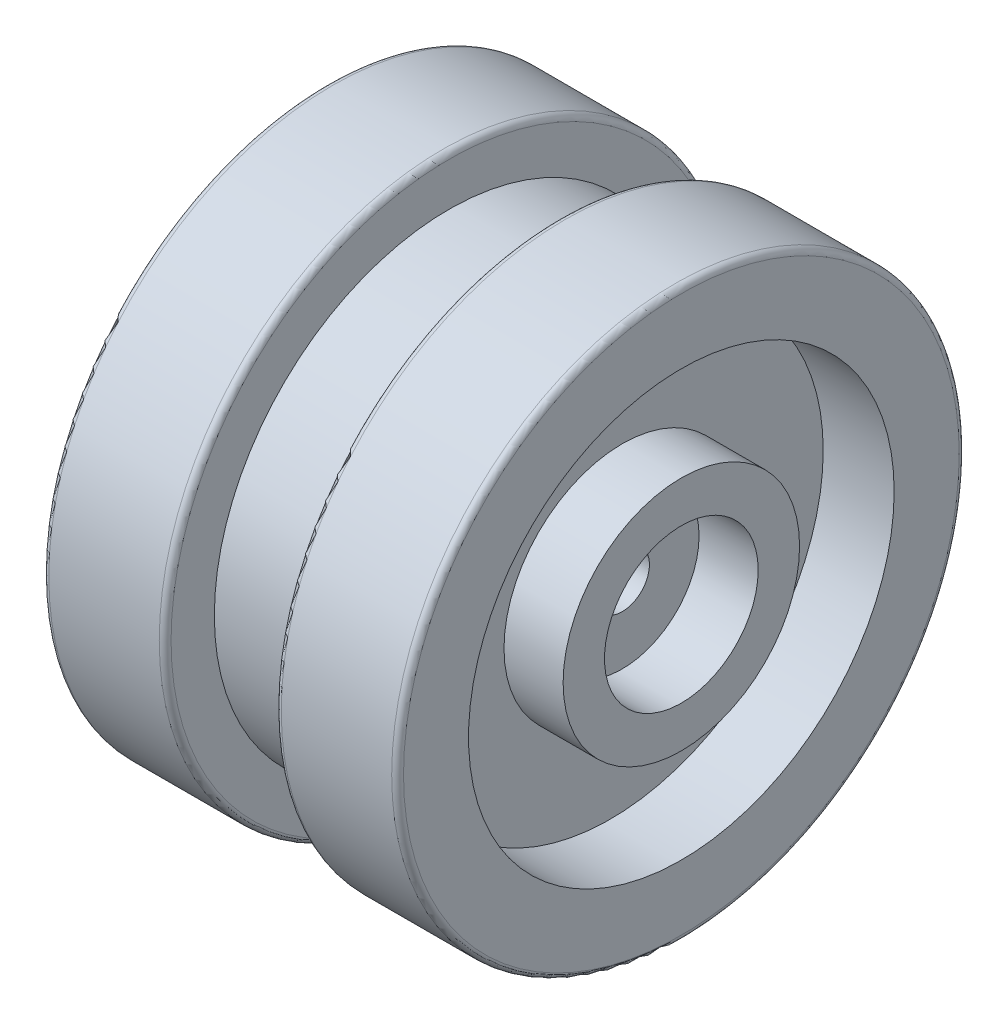
ISO-10303-21;
HEADER;
FILE_DESCRIPTION(('STEP AP214'),'2;1');
FILE_NAME('part.step','',(''),(''),'','','');
FILE_SCHEMA(('AUTOMOTIVE_DESIGN { 1 0 10303 214 1 1 1 1 }'));
ENDSEC;
DATA;
#1=APPLICATION_CONTEXT('core data for automotive mechanical design processes');
#2=APPLICATION_PROTOCOL_DEFINITION('international standard','automotive_design',2000,#1);
#3=PRODUCT_CONTEXT('',#1,'mechanical');
#4=PRODUCT('Part','Part','',(#3));
#5=PRODUCT_RELATED_PRODUCT_CATEGORY('part','',(#4));
#6=PRODUCT_DEFINITION_FORMATION('','',#4);
#7=PRODUCT_DEFINITION_CONTEXT('part definition',#1,'design');
#8=PRODUCT_DEFINITION('design','',#6,#7);
#9=PRODUCT_DEFINITION_SHAPE('','',#8);
#10=(LENGTH_UNIT() NAMED_UNIT(*) SI_UNIT(.MILLI.,.METRE.));
#11=(NAMED_UNIT(*) PLANE_ANGLE_UNIT() SI_UNIT($,.RADIAN.));
#12=(NAMED_UNIT(*) SI_UNIT($,.STERADIAN.) SOLID_ANGLE_UNIT());
#13=UNCERTAINTY_MEASURE_WITH_UNIT(LENGTH_MEASURE(1.E-05),#10,'distance_accuracy_value','');
#14=(GEOMETRIC_REPRESENTATION_CONTEXT(3) GLOBAL_UNCERTAINTY_ASSIGNED_CONTEXT((#13)) GLOBAL_UNIT_ASSIGNED_CONTEXT((#10,
#11,#12)) REPRESENTATION_CONTEXT('',''));
#15=CARTESIAN_POINT('',(0.,0.,0.));
#16=DIRECTION('',(0.,0.,1.));
#17=DIRECTION('',(1.,0.,0.));
#18=AXIS2_PLACEMENT_3D('',#15,#16,#17);
#19=CARTESIAN_POINT('',(7.57479912463906,-18.4842605379604,0.));
#20=DIRECTION('',(1.,0.,0.));
#21=DIRECTION('',(0.,0.,-1.));
#22=AXIS2_PLACEMENT_3D('',#19,#20,#21);
#23=CYLINDRICAL_SURFACE('',#22,8.);
#24=CARTESIAN_POINT('',(11.5747991246391,-18.4842605379604,0.));
#25=DIRECTION('',(1.,0.,0.));
#26=DIRECTION('',(0.,0.,-1.));
#27=AXIS2_PLACEMENT_3D('',#24,#25,#26);
#28=CIRCLE('',#27,8.);
#29=CARTESIAN_POINT('',(11.5747991246391,-18.4842605379604,-8.));
#30=VERTEX_POINT('',#29);
#31=EDGE_CURVE('E10',#30,#30,#28,.T.);
#32=ORIENTED_EDGE('',*,*,#31,.T.);
#33=EDGE_LOOP('',(#32));
#34=FACE_BOUND('',#33,.T.);
#35=CARTESIAN_POINT('',(12.5747991246391,-18.4842605379604,0.));
#36=DIRECTION('',(1.,0.,0.));
#37=DIRECTION('',(0.,0.,-1.));
#38=AXIS2_PLACEMENT_3D('',#35,#36,#37);
#39=CIRCLE('',#38,8.);
#40=CARTESIAN_POINT('',(12.5747991246391,-18.4842605379604,-8.));
#41=VERTEX_POINT('',#40);
#42=EDGE_CURVE('E63',#41,#41,#39,.F.);
#43=ORIENTED_EDGE('',*,*,#42,.T.);
#44=EDGE_LOOP('',(#43));
#45=FACE_BOUND('',#44,.T.);
#46=ADVANCED_FACE('F45',(#34,#45),#23,.T.);
#47=CARTESIAN_POINT('',(-2.08520087536094,1.35573946203964,0.));
#48=DIRECTION('',(-1.,0.,0.));
#49=DIRECTION('',(0.,0.,1.));
#50=AXIS2_PLACEMENT_3D('',#47,#48,#49);
#51=PLANE('',#50);
#52=CARTESIAN_POINT('',(-2.08520087536094,-18.4842605379604,0.));
#53=DIRECTION('',(-1.,0.,0.));
#54=DIRECTION('',(0.,0.,1.));
#55=AXIS2_PLACEMENT_3D('',#52,#53,#54);
#56=CIRCLE('',#55,23.5);
#57=CARTESIAN_POINT('',(-2.08520087536094,-18.4842605379604,23.5));
#58=VERTEX_POINT('',#57);
#59=EDGE_CURVE('E60',#58,#58,#56,.F.);
#60=ORIENTED_EDGE('',*,*,#59,.T.);
#61=EDGE_LOOP('',(#60));
#62=FACE_BOUND('',#61,.T.);
#63=CARTESIAN_POINT('',(-2.08520087536094,-18.4842605379604,0.));
#64=DIRECTION('',(-1.,0.,0.));
#65=DIRECTION('',(0.,0.,1.));
#66=AXIS2_PLACEMENT_3D('',#63,#64,#65);
#67=CIRCLE('',#66,19.84);
#68=CARTESIAN_POINT('',(-2.08520087536094,-18.4842605379604,19.84));
#69=VERTEX_POINT('',#68);
#70=EDGE_CURVE('E112',#69,#69,#67,.T.);
#71=ORIENTED_EDGE('',*,*,#70,.T.);
#72=EDGE_LOOP('',(#71));
#73=FACE_BOUND('',#72,.T.);
#74=ADVANCED_FACE('F150',(#62,#73),#51,.F.);
#75=CARTESIAN_POINT('',(-12.4252008753609,-18.4842605379604,0.));
#76=DIRECTION('',(-1.,0.,0.));
#77=DIRECTION('',(0.,0.,1.));
#78=AXIS2_PLACEMENT_3D('',#75,#76,#77);
#79=CYLINDRICAL_SURFACE('',#78,24.);
#80=CARTESIAN_POINT('',(-11.9252008753609,-18.4842605379604,0.));
#81=DIRECTION('',(1.,0.,0.));
#82=DIRECTION('',(0.,0.,-1.));
#83=AXIS2_PLACEMENT_3D('',#80,#81,#82);
#84=CIRCLE('',#83,24.);
#85=CARTESIAN_POINT('',(-11.9252008753609,-18.4842605379604,-24.));
#86=VERTEX_POINT('',#85);
#87=EDGE_CURVE('E143',#86,#86,#84,.T.);
#88=ORIENTED_EDGE('',*,*,#87,.T.);
#89=EDGE_LOOP('',(#88));
#90=FACE_BOUND('',#89,.T.);
#91=CARTESIAN_POINT('',(-2.58520087536094,-18.4842605379604,0.));
#92=DIRECTION('',(-1.,0.,0.));
#93=DIRECTION('',(0.,0.,1.));
#94=AXIS2_PLACEMENT_3D('',#91,#92,#93);
#95=CIRCLE('',#94,24.);
#96=CARTESIAN_POINT('',(-2.58520087536094,-18.4842605379604,24.));
#97=VERTEX_POINT('',#96);
#98=EDGE_CURVE('E139',#97,#97,#95,.T.);
#99=ORIENTED_EDGE('',*,*,#98,.T.);
#100=EDGE_LOOP('',(#99));
#101=FACE_BOUND('',#100,.T.);
#102=ADVANCED_FACE('F159',(#90,#101),#79,.T.);
#103=CARTESIAN_POINT('',(-12.4252008753609,5.51573946203964,0.));
#104=DIRECTION('',(1.,0.,0.));
#105=DIRECTION('',(0.,0.,-1.));
#106=AXIS2_PLACEMENT_3D('',#103,#104,#105);
#107=PLANE('',#106);
#108=CARTESIAN_POINT('',(-12.4252008753609,-18.4842605379604,0.));
#109=DIRECTION('',(-1.,0.,0.));
#110=DIRECTION('',(0.,0.,1.));
#111=AXIS2_PLACEMENT_3D('',#108,#109,#110);
#112=CIRCLE('',#111,18.);
#113=CARTESIAN_POINT('',(-12.4252008753609,-18.4842605379604,18.));
#114=VERTEX_POINT('',#113);
#115=EDGE_CURVE('E96',#114,#114,#112,.T.);
#116=ORIENTED_EDGE('',*,*,#115,.F.);
#117=EDGE_LOOP('',(#116));
#118=FACE_BOUND('',#117,.T.);
#119=CARTESIAN_POINT('',(-12.4252008753609,-18.4842605379604,0.));
#120=DIRECTION('',(1.,0.,0.));
#121=DIRECTION('',(0.,0.,-1.));
#122=AXIS2_PLACEMENT_3D('',#119,#120,#121);
#123=CIRCLE('',#122,23.5);
#124=CARTESIAN_POINT('',(-12.4252008753609,-18.4842605379604,-23.5));
#125=VERTEX_POINT('',#124);
#126=EDGE_CURVE('E135',#125,#125,#123,.F.);
#127=ORIENTED_EDGE('',*,*,#126,.T.);
#128=EDGE_LOOP('',(#127));
#129=FACE_BOUND('',#128,.T.);
#130=ADVANCED_FACE('F161',(#118,#129),#107,.F.);
#131=CARTESIAN_POINT('',(17.5747991246391,-18.4842605379604,0.));
#132=DIRECTION('',(-1.,0.,0.));
#133=DIRECTION('',(0.,0.,1.));
#134=AXIS2_PLACEMENT_3D('',#131,#132,#133);
#135=PLANE('',#134);
#136=CARTESIAN_POINT('',(17.5747991246391,-18.4842605379604,0.));
#137=DIRECTION('',(1.,0.,0.));
#138=DIRECTION('',(0.,0.,-1.));
#139=AXIS2_PLACEMENT_3D('',#136,#137,#138);
#140=CIRCLE('',#139,18.);
#141=CARTESIAN_POINT('',(17.5747991246391,-18.4842605379604,-18.));
#142=VERTEX_POINT('',#141);
#143=EDGE_CURVE('E104',#142,#142,#140,.T.);
#144=ORIENTED_EDGE('',*,*,#143,.F.);
#145=EDGE_LOOP('',(#144));
#146=FACE_BOUND('',#145,.T.);
#147=CARTESIAN_POINT('',(17.5747991246391,-18.4842605379604,0.));
#148=DIRECTION('',(-1.,0.,0.));
#149=DIRECTION('',(0.,0.,1.));
#150=AXIS2_PLACEMENT_3D('',#147,#148,#149);
#151=CIRCLE('',#150,23.5);
#152=CARTESIAN_POINT('',(17.5747991246391,-18.4842605379604,23.5));
#153=VERTEX_POINT('',#152);
#154=EDGE_CURVE('E131',#153,#153,#151,.F.);
#155=ORIENTED_EDGE('',*,*,#154,.T.);
#156=EDGE_LOOP('',(#155));
#157=FACE_BOUND('',#156,.T.);
#158=ADVANCED_FACE('F169',(#146,#157),#135,.F.);
#159=CARTESIAN_POINT('',(-12.4252008753609,-18.4842605379604,0.));
#160=DIRECTION('',(-1.,0.,0.));
#161=DIRECTION('',(0.,0.,1.));
#162=AXIS2_PLACEMENT_3D('',#159,#160,#161);
#163=CYLINDRICAL_SURFACE('',#162,24.);
#164=CARTESIAN_POINT('',(17.0747991246391,-18.4842605379604,0.));
#165=DIRECTION('',(-1.,0.,0.));
#166=DIRECTION('',(0.,0.,1.));
#167=AXIS2_PLACEMENT_3D('',#164,#165,#166);
#168=CIRCLE('',#167,24.);
#169=CARTESIAN_POINT('',(17.0747991246391,-18.4842605379604,24.));
#170=VERTEX_POINT('',#169);
#171=EDGE_CURVE('E127',#170,#170,#168,.T.);
#172=ORIENTED_EDGE('',*,*,#171,.T.);
#173=EDGE_LOOP('',(#172));
#174=FACE_BOUND('',#173,.T.);
#175=CARTESIAN_POINT('',(7.73479912463906,-18.4842605379604,0.));
#176=DIRECTION('',(1.,0.,0.));
#177=DIRECTION('',(0.,0.,-1.));
#178=AXIS2_PLACEMENT_3D('',#175,#176,#177);
#179=CIRCLE('',#178,24.);
#180=CARTESIAN_POINT('',(7.73479912463906,-18.4842605379604,-24.));
#181=VERTEX_POINT('',#180);
#182=EDGE_CURVE('E123',#181,#181,#179,.T.);
#183=ORIENTED_EDGE('',*,*,#182,.T.);
#184=EDGE_LOOP('',(#183));
#185=FACE_BOUND('',#184,.T.);
#186=ADVANCED_FACE('F215',(#174,#185),#163,.T.);
#187=CARTESIAN_POINT('',(7.23479912463906,1.35573946203964,0.));
#188=DIRECTION('',(1.,0.,0.));
#189=DIRECTION('',(0.,0.,-1.));
#190=AXIS2_PLACEMENT_3D('',#187,#188,#189);
#191=PLANE('',#190);
#192=CARTESIAN_POINT('',(7.23479912463906,-18.4842605379604,0.));
#193=DIRECTION('',(1.,0.,0.));
#194=DIRECTION('',(0.,0.,-1.));
#195=AXIS2_PLACEMENT_3D('',#192,#193,#194);
#196=CIRCLE('',#195,23.5);
#197=CARTESIAN_POINT('',(7.23479912463906,-18.4842605379604,-23.5));
#198=VERTEX_POINT('',#197);
#199=EDGE_CURVE('E54',#198,#198,#196,.F.);
#200=ORIENTED_EDGE('',*,*,#199,.T.);
#201=EDGE_LOOP('',(#200));
#202=FACE_BOUND('',#201,.T.);
#203=CARTESIAN_POINT('',(7.23479912463906,-18.4842605379604,0.));
#204=DIRECTION('',(-1.,0.,0.));
#205=DIRECTION('',(0.,0.,1.));
#206=AXIS2_PLACEMENT_3D('',#203,#204,#205);
#207=CIRCLE('',#206,19.84);
#208=CARTESIAN_POINT('',(7.23479912463906,-18.4842605379604,19.84));
#209=VERTEX_POINT('',#208);
#210=EDGE_CURVE('E119',#209,#209,#207,.T.);
#211=ORIENTED_EDGE('',*,*,#210,.F.);
#212=EDGE_LOOP('',(#211));
#213=FACE_BOUND('',#212,.T.);
#214=ADVANCED_FACE('F211',(#202,#213),#191,.F.);
#215=CARTESIAN_POINT('',(-12.4252008753609,-18.4842605379604,0.));
#216=DIRECTION('',(-1.,0.,0.));
#217=DIRECTION('',(0.,0.,1.));
#218=AXIS2_PLACEMENT_3D('',#215,#216,#217);
#219=CYLINDRICAL_SURFACE('',#218,19.84);
#220=ORIENTED_EDGE('',*,*,#70,.F.);
#221=EDGE_LOOP('',(#220));
#222=FACE_BOUND('',#221,.T.);
#223=ORIENTED_EDGE('',*,*,#210,.T.);
#224=EDGE_LOOP('',(#223));
#225=FACE_BOUND('',#224,.T.);
#226=ADVANCED_FACE('F207',(#222,#225),#219,.T.);
#227=CARTESIAN_POINT('',(17.0747991246391,-18.4842605379604,0.));
#228=DIRECTION('',(-1.,0.,0.));
#229=DIRECTION('',(0.,0.,1.));
#230=AXIS2_PLACEMENT_3D('',#227,#228,#229);
#231=TOROIDAL_SURFACE('',#230,23.5,0.5);
#232=ORIENTED_EDGE('',*,*,#154,.F.);
#233=EDGE_LOOP('',(#232));
#234=FACE_BOUND('',#233,.T.);
#235=ORIENTED_EDGE('',*,*,#171,.F.);
#236=EDGE_LOOP('',(#235));
#237=FACE_BOUND('',#236,.T.);
#238=ADVANCED_FACE('F210',(#234,#237),#231,.T.);
#239=CARTESIAN_POINT('',(-11.9252008753609,-18.4842605379604,0.));
#240=DIRECTION('',(1.,0.,0.));
#241=DIRECTION('',(0.,0.,-1.));
#242=AXIS2_PLACEMENT_3D('',#239,#240,#241);
#243=TOROIDAL_SURFACE('',#242,23.5,0.5);
#244=ORIENTED_EDGE('',*,*,#87,.F.);
#245=EDGE_LOOP('',(#244));
#246=FACE_BOUND('',#245,.T.);
#247=ORIENTED_EDGE('',*,*,#126,.F.);
#248=EDGE_LOOP('',(#247));
#249=FACE_BOUND('',#248,.T.);
#250=ADVANCED_FACE('F156',(#246,#249),#243,.T.);
#251=CARTESIAN_POINT('',(-2.58520087536094,-18.4842605379604,0.));
#252=DIRECTION('',(-1.,0.,0.));
#253=DIRECTION('',(0.,0.,1.));
#254=AXIS2_PLACEMENT_3D('',#251,#252,#253);
#255=TOROIDAL_SURFACE('',#254,23.5,0.5);
#256=ORIENTED_EDGE('',*,*,#59,.F.);
#257=EDGE_LOOP('',(#256));
#258=FACE_BOUND('',#257,.T.);
#259=ORIENTED_EDGE('',*,*,#98,.F.);
#260=EDGE_LOOP('',(#259));
#261=FACE_BOUND('',#260,.T.);
#262=ADVANCED_FACE('F153',(#258,#261),#255,.T.);
#263=CARTESIAN_POINT('',(7.73479912463906,-18.4842605379604,0.));
#264=DIRECTION('',(1.,0.,0.));
#265=DIRECTION('',(0.,0.,-1.));
#266=AXIS2_PLACEMENT_3D('',#263,#264,#265);
#267=TOROIDAL_SURFACE('',#266,23.5,0.5);
#268=ORIENTED_EDGE('',*,*,#182,.F.);
#269=EDGE_LOOP('',(#268));
#270=FACE_BOUND('',#269,.T.);
#271=ORIENTED_EDGE('',*,*,#199,.F.);
#272=EDGE_LOOP('',(#271));
#273=FACE_BOUND('',#272,.T.);
#274=ADVANCED_FACE('F47',(#270,#273),#267,.T.);
#275=CARTESIAN_POINT('',(11.5747991246391,-18.4842605379604,0.));
#276=DIRECTION('',(1.,0.,0.));
#277=DIRECTION('',(0.,0.,-1.));
#278=AXIS2_PLACEMENT_3D('',#275,#276,#277);
#279=CYLINDRICAL_SURFACE('',#278,18.);
#280=CARTESIAN_POINT('',(11.5747991246391,-18.4842605379604,0.));
#281=DIRECTION('',(1.,0.,0.));
#282=DIRECTION('',(0.,0.,-1.));
#283=AXIS2_PLACEMENT_3D('',#280,#281,#282);
#284=CIRCLE('',#283,18.);
#285=CARTESIAN_POINT('',(11.5747991246391,-18.4842605379604,-18.));
#286=VERTEX_POINT('',#285);
#287=EDGE_CURVE('E108',#286,#286,#284,.T.);
#288=ORIENTED_EDGE('',*,*,#287,.F.);
#289=EDGE_LOOP('',(#288));
#290=FACE_BOUND('',#289,.T.);
#291=ORIENTED_EDGE('',*,*,#143,.T.);
#292=EDGE_LOOP('',(#291));
#293=FACE_BOUND('',#292,.T.);
#294=ADVANCED_FACE('F202',(#290,#293),#279,.F.);
#295=CARTESIAN_POINT('',(11.5747991246391,-18.4842605379604,0.));
#296=DIRECTION('',(1.,0.,0.));
#297=DIRECTION('',(0.,0.,-1.));
#298=AXIS2_PLACEMENT_3D('',#295,#296,#297);
#299=PLANE('',#298);
#300=ORIENTED_EDGE('',*,*,#31,.F.);
#301=EDGE_LOOP('',(#300));
#302=FACE_BOUND('',#301,.T.);
#303=ORIENTED_EDGE('',*,*,#287,.T.);
#304=EDGE_LOOP('',(#303));
#305=FACE_BOUND('',#304,.T.);
#306=ADVANCED_FACE('F195',(#302,#305),#299,.T.);
#307=CARTESIAN_POINT('',(-6.42520087536094,-18.4842605379604,0.));
#308=DIRECTION('',(-1.,0.,0.));
#309=DIRECTION('',(0.,0.,1.));
#310=AXIS2_PLACEMENT_3D('',#307,#308,#309);
#311=PLANE('',#310);
#312=CARTESIAN_POINT('',(-6.42520087536094,-18.4842605379604,0.));
#313=DIRECTION('',(-1.,0.,0.));
#314=DIRECTION('',(0.,0.,1.));
#315=AXIS2_PLACEMENT_3D('',#312,#313,#314);
#316=CIRCLE('',#315,10.);
#317=CARTESIAN_POINT('',(-6.42520087536094,-18.4842605379604,10.));
#318=VERTEX_POINT('',#317);
#319=EDGE_CURVE('E90',#318,#318,#316,.T.);
#320=ORIENTED_EDGE('',*,*,#319,.F.);
#321=EDGE_LOOP('',(#320));
#322=FACE_BOUND('',#321,.T.);
#323=CARTESIAN_POINT('',(-6.42520087536094,-18.4842605379604,0.));
#324=DIRECTION('',(-1.,0.,0.));
#325=DIRECTION('',(0.,0.,1.));
#326=AXIS2_PLACEMENT_3D('',#323,#324,#325);
#327=CIRCLE('',#326,18.);
#328=CARTESIAN_POINT('',(-6.42520087536094,-18.4842605379604,18.));
#329=VERTEX_POINT('',#328);
#330=EDGE_CURVE('E100',#329,#329,#327,.T.);
#331=ORIENTED_EDGE('',*,*,#330,.T.);
#332=EDGE_LOOP('',(#331));
#333=FACE_BOUND('',#332,.T.);
#334=ADVANCED_FACE('F192',(#322,#333),#311,.T.);
#335=CARTESIAN_POINT('',(-6.42520087536094,-18.4842605379604,0.));
#336=DIRECTION('',(-1.,0.,0.));
#337=DIRECTION('',(0.,0.,1.));
#338=AXIS2_PLACEMENT_3D('',#335,#336,#337);
#339=CYLINDRICAL_SURFACE('',#338,18.);
#340=ORIENTED_EDGE('',*,*,#330,.F.);
#341=EDGE_LOOP('',(#340));
#342=FACE_BOUND('',#341,.T.);
#343=ORIENTED_EDGE('',*,*,#115,.T.);
#344=EDGE_LOOP('',(#343));
#345=FACE_BOUND('',#344,.T.);
#346=ADVANCED_FACE('F187',(#342,#345),#339,.F.);
#347=CARTESIAN_POINT('',(-12.4252008753609,-18.4842605379604,0.));
#348=DIRECTION('',(-1.,0.,0.));
#349=DIRECTION('',(0.,0.,1.));
#350=AXIS2_PLACEMENT_3D('',#347,#348,#349);
#351=PLANE('',#350);
#352=CARTESIAN_POINT('',(-12.4252008753609,-18.4842605379604,0.));
#353=DIRECTION('',(-1.,0.,0.));
#354=DIRECTION('',(0.,0.,1.));
#355=AXIS2_PLACEMENT_3D('',#352,#353,#354);
#356=CIRCLE('',#355,6.5);
#357=CARTESIAN_POINT('',(-12.4252008753609,-18.4842605379604,6.5));
#358=VERTEX_POINT('',#357);
#359=EDGE_CURVE('E66',#358,#358,#356,.T.);
#360=ORIENTED_EDGE('',*,*,#359,.F.);
#361=EDGE_LOOP('',(#360));
#362=FACE_BOUND('',#361,.T.);
#363=CARTESIAN_POINT('',(-12.4252008753609,-18.4842605379604,0.));
#364=DIRECTION('',(-1.,0.,0.));
#365=DIRECTION('',(0.,0.,1.));
#366=AXIS2_PLACEMENT_3D('',#363,#364,#365);
#367=CIRCLE('',#366,10.);
#368=CARTESIAN_POINT('',(-12.4252008753609,-18.4842605379604,10.));
#369=VERTEX_POINT('',#368);
#370=EDGE_CURVE('E92',#369,#369,#367,.T.);
#371=ORIENTED_EDGE('',*,*,#370,.T.);
#372=EDGE_LOOP('',(#371));
#373=FACE_BOUND('',#372,.T.);
#374=ADVANCED_FACE('F183',(#362,#373),#351,.T.);
#375=CARTESIAN_POINT('',(-12.4252008753609,-18.4842605379604,0.));
#376=DIRECTION('',(1.,0.,0.));
#377=DIRECTION('',(0.,0.,-1.));
#378=AXIS2_PLACEMENT_3D('',#375,#376,#377);
#379=CYLINDRICAL_SURFACE('',#378,10.);
#380=ORIENTED_EDGE('',*,*,#370,.F.);
#381=EDGE_LOOP('',(#380));
#382=FACE_BOUND('',#381,.T.);
#383=ORIENTED_EDGE('',*,*,#319,.T.);
#384=EDGE_LOOP('',(#383));
#385=FACE_BOUND('',#384,.T.);
#386=ADVANCED_FACE('F186',(#382,#385),#379,.T.);
#387=CARTESIAN_POINT('',(-7.42520087536094,-18.4842605379604,0.));
#388=DIRECTION('',(-1.,0.,0.));
#389=DIRECTION('',(0.,0.,1.));
#390=AXIS2_PLACEMENT_3D('',#387,#388,#389);
#391=CYLINDRICAL_SURFACE('',#390,6.5);
#392=CARTESIAN_POINT('',(-7.42520087536094,-18.4842605379604,0.));
#393=DIRECTION('',(-1.,0.,0.));
#394=DIRECTION('',(0.,0.,1.));
#395=AXIS2_PLACEMENT_3D('',#392,#393,#394);
#396=CIRCLE('',#395,6.5);
#397=CARTESIAN_POINT('',(-7.42520087536094,-18.4842605379604,6.5));
#398=VERTEX_POINT('',#397);
#399=EDGE_CURVE('E73',#398,#398,#396,.T.);
#400=ORIENTED_EDGE('',*,*,#399,.F.);
#401=EDGE_LOOP('',(#400));
#402=FACE_BOUND('',#401,.T.);
#403=ORIENTED_EDGE('',*,*,#359,.T.);
#404=EDGE_LOOP('',(#403));
#405=FACE_BOUND('',#404,.T.);
#406=ADVANCED_FACE('F181',(#402,#405),#391,.F.);
#407=CARTESIAN_POINT('',(-7.42520087536094,-18.4842605379604,0.));
#408=DIRECTION('',(-1.,0.,0.));
#409=DIRECTION('',(0.,0.,1.));
#410=AXIS2_PLACEMENT_3D('',#407,#408,#409);
#411=PLANE('',#410);
#412=CARTESIAN_POINT('',(-7.42520087536094,-18.4842605379604,0.));
#413=DIRECTION('',(-1.,0.,0.));
#414=DIRECTION('',(0.,0.,1.));
#415=AXIS2_PLACEMENT_3D('',#412,#413,#414);
#416=CIRCLE('',#415,2.3);
#417=CARTESIAN_POINT('',(-7.42520087536094,-18.4842605379604,2.3));
#418=VERTEX_POINT('',#417);
#419=EDGE_CURVE('E264',#418,#418,#416,.T.);
#420=ORIENTED_EDGE('',*,*,#419,.F.);
#421=EDGE_LOOP('',(#420));
#422=FACE_BOUND('',#421,.T.);
#423=ORIENTED_EDGE('',*,*,#399,.T.);
#424=EDGE_LOOP('',(#423));
#425=FACE_BOUND('',#424,.T.);
#426=ADVANCED_FACE('F246',(#422,#425),#411,.T.);
#427=CARTESIAN_POINT('',(12.5747991246391,-18.4842605379604,0.));
#428=DIRECTION('',(1.,0.,0.));
#429=DIRECTION('',(0.,0.,-1.));
#430=AXIS2_PLACEMENT_3D('',#427,#428,#429);
#431=CYLINDRICAL_SURFACE('',#430,10.);
#432=CARTESIAN_POINT('',(12.5747991246391,-18.4842605379604,0.));
#433=DIRECTION('',(1.,0.,0.));
#434=DIRECTION('',(0.,0.,-1.));
#435=AXIS2_PLACEMENT_3D('',#432,#433,#434);
#436=CIRCLE('',#435,10.);
#437=CARTESIAN_POINT('',(12.5747991246391,-18.4842605379604,-10.));
#438=VERTEX_POINT('',#437);
#439=EDGE_CURVE('E67',#438,#438,#436,.T.);
#440=ORIENTED_EDGE('',*,*,#439,.T.);
#441=EDGE_LOOP('',(#440));
#442=FACE_BOUND('',#441,.T.);
#443=CARTESIAN_POINT('',(17.5747991246391,-18.4842605379604,0.));
#444=DIRECTION('',(1.,0.,0.));
#445=DIRECTION('',(0.,0.,-1.));
#446=AXIS2_PLACEMENT_3D('',#443,#444,#445);
#447=CIRCLE('',#446,10.);
#448=CARTESIAN_POINT('',(17.5747991246391,-18.4842605379604,-10.));
#449=VERTEX_POINT('',#448);
#450=EDGE_CURVE('E76',#449,#449,#447,.T.);
#451=ORIENTED_EDGE('',*,*,#450,.F.);
#452=EDGE_LOOP('',(#451));
#453=FACE_BOUND('',#452,.T.);
#454=ADVANCED_FACE('F238',(#442,#453),#431,.T.);
#455=CARTESIAN_POINT('',(12.5747991246391,-18.4842605379604,0.));
#456=DIRECTION('',(1.,0.,0.));
#457=DIRECTION('',(0.,0.,-1.));
#458=AXIS2_PLACEMENT_3D('',#455,#456,#457);
#459=PLANE('',#458);
#460=ORIENTED_EDGE('',*,*,#42,.F.);
#461=EDGE_LOOP('',(#460));
#462=FACE_BOUND('',#461,.T.);
#463=ORIENTED_EDGE('',*,*,#439,.F.);
#464=EDGE_LOOP('',(#463));
#465=FACE_BOUND('',#464,.T.);
#466=ADVANCED_FACE('F229',(#462,#465),#459,.F.);
#467=CARTESIAN_POINT('',(17.5747991246391,-18.4842605379604,0.));
#468=DIRECTION('',(1.,0.,0.));
#469=DIRECTION('',(0.,0.,-1.));
#470=AXIS2_PLACEMENT_3D('',#467,#468,#469);
#471=CIRCLE('',#470,6.5);
#472=CARTESIAN_POINT('',(17.5747991246391,-18.4842605379604,-6.5));
#473=VERTEX_POINT('',#472);
#474=EDGE_CURVE('E85',#473,#473,#471,.T.);
#475=ORIENTED_EDGE('',*,*,#474,.F.);
#476=EDGE_LOOP('',(#475));
#477=FACE_BOUND('',#476,.T.);
#478=ORIENTED_EDGE('',*,*,#450,.T.);
#479=EDGE_LOOP('',(#478));
#480=FACE_BOUND('',#479,.T.);
#481=ADVANCED_FACE('F221',(#477,#480),#135,.F.);
#482=CARTESIAN_POINT('',(12.5747991246391,-18.4842605379604,0.));
#483=DIRECTION('',(1.,0.,0.));
#484=DIRECTION('',(0.,0.,-1.));
#485=AXIS2_PLACEMENT_3D('',#482,#483,#484);
#486=CYLINDRICAL_SURFACE('',#485,6.5);
#487=CARTESIAN_POINT('',(12.5747991246391,-18.4842605379604,0.));
#488=DIRECTION('',(1.,0.,0.));
#489=DIRECTION('',(0.,0.,-1.));
#490=AXIS2_PLACEMENT_3D('',#487,#488,#489);
#491=CIRCLE('',#490,6.5);
#492=CARTESIAN_POINT('',(12.5747991246391,-18.4842605379604,-6.5));
#493=VERTEX_POINT('',#492);
#494=EDGE_CURVE('E82',#493,#493,#491,.T.);
#495=ORIENTED_EDGE('',*,*,#494,.F.);
#496=EDGE_LOOP('',(#495));
#497=FACE_BOUND('',#496,.T.);
#498=ORIENTED_EDGE('',*,*,#474,.T.);
#499=EDGE_LOOP('',(#498));
#500=FACE_BOUND('',#499,.T.);
#501=ADVANCED_FACE('F228',(#497,#500),#486,.F.);
#502=CARTESIAN_POINT('',(12.5747991246391,-18.4842605379604,0.));
#503=DIRECTION('',(1.,0.,0.));
#504=DIRECTION('',(0.,0.,-1.));
#505=AXIS2_PLACEMENT_3D('',#502,#503,#504);
#506=PLANE('',#505);
#507=CARTESIAN_POINT('',(12.5747991246391,-18.4842605379604,0.));
#508=DIRECTION('',(1.,0.,0.));
#509=DIRECTION('',(0.,0.,-1.));
#510=AXIS2_PLACEMENT_3D('',#507,#508,#509);
#511=CIRCLE('',#510,2.3);
#512=CARTESIAN_POINT('',(12.5747991246391,-18.4842605379604,-2.3));
#513=VERTEX_POINT('',#512);
#514=EDGE_CURVE('E49',#513,#513,#511,.T.);
#515=ORIENTED_EDGE('',*,*,#514,.F.);
#516=EDGE_LOOP('',(#515));
#517=FACE_BOUND('',#516,.T.);
#518=ORIENTED_EDGE('',*,*,#494,.T.);
#519=EDGE_LOOP('',(#518));
#520=FACE_BOUND('',#519,.T.);
#521=ADVANCED_FACE('F235',(#517,#520),#506,.T.);
#522=CARTESIAN_POINT('',(17.5747991246391,-18.4842605379604,0.));
#523=DIRECTION('',(-1.,0.,0.));
#524=DIRECTION('',(0.,0.,1.));
#525=AXIS2_PLACEMENT_3D('',#522,#523,#524);
#526=CYLINDRICAL_SURFACE('',#525,2.3);
#527=ORIENTED_EDGE('',*,*,#419,.T.);
#528=EDGE_LOOP('',(#527));
#529=FACE_BOUND('',#528,.T.);
#530=ORIENTED_EDGE('',*,*,#514,.T.);
#531=EDGE_LOOP('',(#530));
#532=FACE_BOUND('',#531,.T.);
#533=ADVANCED_FACE('F255',(#529,#532),#526,.F.);
#534=CLOSED_SHELL('',(#46,#74,#102,#130,#158,#186,#214,#226,#238,#250,#262,#274,#294,#306,#334,
#346,#374,#386,#406,#426,#454,#466,#481,#501,#521,#533));
#535=MANIFOLD_SOLID_BREP('B2',#534);
#536=ADVANCED_BREP_SHAPE_REPRESENTATION('',(#18,#535),#14);
#537=SHAPE_DEFINITION_REPRESENTATION(#9,#536);
ENDSEC;
END-ISO-10303-21;
